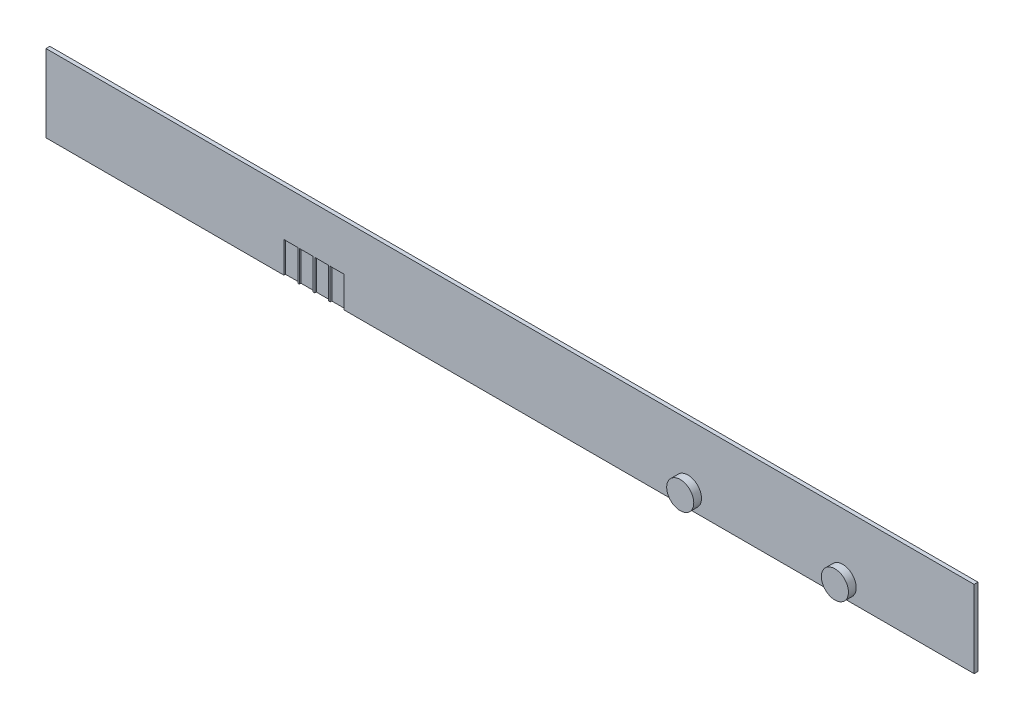
ISO-10303-21;
HEADER;
FILE_DESCRIPTION(('STEP AP214'),'2;1');
FILE_NAME('part.step','',(''),(''),'','','');
FILE_SCHEMA(('AUTOMOTIVE_DESIGN { 1 0 10303 214 1 1 1 1 }'));
ENDSEC;
DATA;
#1=APPLICATION_CONTEXT('core data for automotive mechanical design processes');
#2=APPLICATION_PROTOCOL_DEFINITION('international standard','automotive_design',2000,#1);
#3=PRODUCT_CONTEXT('',#1,'mechanical');
#4=PRODUCT('Part','Part','',(#3));
#5=PRODUCT_RELATED_PRODUCT_CATEGORY('part','',(#4));
#6=PRODUCT_DEFINITION_FORMATION('','',#4);
#7=PRODUCT_DEFINITION_CONTEXT('part definition',#1,'design');
#8=PRODUCT_DEFINITION('design','',#6,#7);
#9=PRODUCT_DEFINITION_SHAPE('','',#8);
#10=(LENGTH_UNIT() NAMED_UNIT(*) SI_UNIT(.MILLI.,.METRE.));
#11=(NAMED_UNIT(*) PLANE_ANGLE_UNIT() SI_UNIT($,.RADIAN.));
#12=(NAMED_UNIT(*) SI_UNIT($,.STERADIAN.) SOLID_ANGLE_UNIT());
#13=UNCERTAINTY_MEASURE_WITH_UNIT(LENGTH_MEASURE(1.E-05),#10,'distance_accuracy_value','');
#14=(GEOMETRIC_REPRESENTATION_CONTEXT(3) GLOBAL_UNCERTAINTY_ASSIGNED_CONTEXT((#13)) GLOBAL_UNIT_ASSIGNED_CONTEXT((#10,
#11,#12)) REPRESENTATION_CONTEXT('',''));
#15=CARTESIAN_POINT('',(0.,0.,0.));
#16=DIRECTION('',(0.,0.,1.));
#17=DIRECTION('',(1.,0.,0.));
#18=AXIS2_PLACEMENT_3D('',#15,#16,#17);
#19=CARTESIAN_POINT('',(60.,-5.,0.5));
#20=DIRECTION('',(-1.,0.,0.));
#21=DIRECTION('',(0.,0.,1.));
#22=AXIS2_PLACEMENT_3D('',#19,#20,#21);
#23=PLANE('',#22);
#24=DIRECTION('',(0.,1.,0.));
#25=VECTOR('',#24,1.);
#26=CARTESIAN_POINT('',(60.,-5.,0.));
#27=LINE('',#26,#25);
#28=CARTESIAN_POINT('',(60.,-5.,0.));
#29=VERTEX_POINT('',#28);
#30=CARTESIAN_POINT('',(60.,5.,0.));
#31=VERTEX_POINT('',#30);
#32=EDGE_CURVE('E299',#29,#31,#27,.T.);
#33=ORIENTED_EDGE('',*,*,#32,.T.);
#34=DIRECTION('',(0.,0.,-1.));
#35=VECTOR('',#34,1.);
#36=CARTESIAN_POINT('',(60.,5.,0.5));
#37=LINE('',#36,#35);
#38=CARTESIAN_POINT('',(60.,5.,0.5));
#39=VERTEX_POINT('',#38);
#40=EDGE_CURVE('E329',#39,#31,#37,.T.);
#41=ORIENTED_EDGE('',*,*,#40,.F.);
#42=DIRECTION('',(0.,1.,0.));
#43=VECTOR('',#42,1.);
#44=CARTESIAN_POINT('',(60.,-5.,0.5));
#45=LINE('',#44,#43);
#46=CARTESIAN_POINT('',(60.,-5.,0.5));
#47=VERTEX_POINT('',#46);
#48=EDGE_CURVE('E300',#47,#39,#45,.T.);
#49=ORIENTED_EDGE('',*,*,#48,.F.);
#50=DIRECTION('',(0.,0.,-1.));
#51=VECTOR('',#50,1.);
#52=CARTESIAN_POINT('',(60.,-5.,0.5));
#53=LINE('',#52,#51);
#54=EDGE_CURVE('E312',#47,#29,#53,.T.);
#55=ORIENTED_EDGE('',*,*,#54,.T.);
#56=EDGE_LOOP('',(#33,#41,#49,#55));
#57=FACE_BOUND('',#56,.T.);
#58=ADVANCED_FACE('F41',(#57),#23,.F.);
#59=CARTESIAN_POINT('',(-60.,5.,0.5));
#60=DIRECTION('',(0.,-1.,0.));
#61=DIRECTION('',(0.,0.,-1.));
#62=AXIS2_PLACEMENT_3D('',#59,#60,#61);
#63=PLANE('',#62);
#64=DIRECTION('',(-1.,0.,0.));
#65=VECTOR('',#64,1.);
#66=CARTESIAN_POINT('',(-60.,5.,0.));
#67=LINE('',#66,#65);
#68=CARTESIAN_POINT('',(-60.,5.,0.));
#69=VERTEX_POINT('',#68);
#70=EDGE_CURVE('E316',#31,#69,#67,.T.);
#71=ORIENTED_EDGE('',*,*,#70,.T.);
#72=DIRECTION('',(0.,0.,-1.));
#73=VECTOR('',#72,1.);
#74=CARTESIAN_POINT('',(-60.,5.,0.5));
#75=LINE('',#74,#73);
#76=CARTESIAN_POINT('',(-60.,5.,0.5));
#77=VERTEX_POINT('',#76);
#78=EDGE_CURVE('E326',#77,#69,#75,.T.);
#79=ORIENTED_EDGE('',*,*,#78,.F.);
#80=DIRECTION('',(-1.,0.,0.));
#81=VECTOR('',#80,1.);
#82=CARTESIAN_POINT('',(-60.,5.,0.5));
#83=LINE('',#82,#81);
#84=EDGE_CURVE('E303',#39,#77,#83,.T.);
#85=ORIENTED_EDGE('',*,*,#84,.F.);
#86=ORIENTED_EDGE('',*,*,#40,.T.);
#87=EDGE_LOOP('',(#71,#79,#85,#86));
#88=FACE_BOUND('',#87,.T.);
#89=ADVANCED_FACE('F365',(#88),#63,.F.);
#90=CARTESIAN_POINT('',(-60.,-5.,0.5));
#91=DIRECTION('',(1.,0.,0.));
#92=DIRECTION('',(0.,0.,-1.));
#93=AXIS2_PLACEMENT_3D('',#90,#91,#92);
#94=PLANE('',#93);
#95=DIRECTION('',(0.,-1.,0.));
#96=VECTOR('',#95,1.);
#97=CARTESIAN_POINT('',(-60.,-5.,0.));
#98=LINE('',#97,#96);
#99=CARTESIAN_POINT('',(-60.,-5.,0.));
#100=VERTEX_POINT('',#99);
#101=EDGE_CURVE('E318',#69,#100,#98,.T.);
#102=ORIENTED_EDGE('',*,*,#101,.T.);
#103=DIRECTION('',(0.,0.,-1.));
#104=VECTOR('',#103,1.);
#105=CARTESIAN_POINT('',(-60.,-5.,0.5));
#106=LINE('',#105,#104);
#107=CARTESIAN_POINT('',(-60.,-5.,0.5));
#108=VERTEX_POINT('',#107);
#109=EDGE_CURVE('E323',#108,#100,#106,.T.);
#110=ORIENTED_EDGE('',*,*,#109,.F.);
#111=DIRECTION('',(0.,-1.,0.));
#112=VECTOR('',#111,1.);
#113=CARTESIAN_POINT('',(-60.,-5.,0.5));
#114=LINE('',#113,#112);
#115=EDGE_CURVE('E306',#77,#108,#114,.T.);
#116=ORIENTED_EDGE('',*,*,#115,.F.);
#117=ORIENTED_EDGE('',*,*,#78,.T.);
#118=EDGE_LOOP('',(#102,#110,#116,#117));
#119=FACE_BOUND('',#118,.T.);
#120=ADVANCED_FACE('F370',(#119),#94,.F.);
#121=CARTESIAN_POINT('',(-60.,-5.,0.5));
#122=DIRECTION('',(0.,1.,0.));
#123=DIRECTION('',(0.,0.,1.));
#124=AXIS2_PLACEMENT_3D('',#121,#122,#123);
#125=PLANE('',#124);
#126=DIRECTION('',(1.,0.,0.));
#127=VECTOR('',#126,1.);
#128=CARTESIAN_POINT('',(-60.,-5.,0.5));
#129=LINE('',#128,#127);
#130=CARTESIAN_POINT('',(-25.45,-5.,0.5));
#131=VERTEX_POINT('',#130);
#132=CARTESIAN_POINT('',(-25.25,-5.,0.5));
#133=VERTEX_POINT('',#132);
#134=EDGE_CURVE('E646',#131,#133,#129,.T.);
#135=ORIENTED_EDGE('',*,*,#134,.F.);
#136=DIRECTION('',(0.,0.,1.));
#137=VECTOR('',#136,1.);
#138=CARTESIAN_POINT('',(-25.45,-5.,0.3));
#139=LINE('',#138,#137);
#140=CARTESIAN_POINT('',(-25.45,-5.,0.3));
#141=VERTEX_POINT('',#140);
#142=EDGE_CURVE('E210',#141,#131,#139,.T.);
#143=ORIENTED_EDGE('',*,*,#142,.F.);
#144=DIRECTION('',(1.,0.,0.));
#145=VECTOR('',#144,1.);
#146=CARTESIAN_POINT('',(-27.25,-5.,0.3));
#147=LINE('',#146,#145);
#148=CARTESIAN_POINT('',(-27.25,-5.,0.3));
#149=VERTEX_POINT('',#148);
#150=EDGE_CURVE('E192',#149,#141,#147,.T.);
#151=ORIENTED_EDGE('',*,*,#150,.F.);
#152=DIRECTION('',(0.,0.,1.));
#153=VECTOR('',#152,1.);
#154=CARTESIAN_POINT('',(-27.25,-5.,0.3));
#155=LINE('',#154,#153);
#156=CARTESIAN_POINT('',(-27.25,-5.,0.5));
#157=VERTEX_POINT('',#156);
#158=EDGE_CURVE('E183',#149,#157,#155,.T.);
#159=ORIENTED_EDGE('',*,*,#158,.T.);
#160=CARTESIAN_POINT('',(-27.45,-5.,0.5));
#161=VERTEX_POINT('',#160);
#162=EDGE_CURVE('E313',#161,#157,#129,.T.);
#163=ORIENTED_EDGE('',*,*,#162,.F.);
#164=DIRECTION('',(0.,0.,1.));
#165=VECTOR('',#164,1.);
#166=CARTESIAN_POINT('',(-27.45,-5.,0.3));
#167=LINE('',#166,#165);
#168=CARTESIAN_POINT('',(-27.45,-5.,0.3));
#169=VERTEX_POINT('',#168);
#170=EDGE_CURVE('E287',#169,#161,#167,.T.);
#171=ORIENTED_EDGE('',*,*,#170,.F.);
#172=DIRECTION('',(1.,0.,0.));
#173=VECTOR('',#172,1.);
#174=CARTESIAN_POINT('',(-29.25,-5.,0.3));
#175=LINE('',#174,#173);
#176=CARTESIAN_POINT('',(-29.25,-5.,0.3));
#177=VERTEX_POINT('',#176);
#178=EDGE_CURVE('E273',#177,#169,#175,.T.);
#179=ORIENTED_EDGE('',*,*,#178,.F.);
#180=DIRECTION('',(0.,0.,1.));
#181=VECTOR('',#180,1.);
#182=CARTESIAN_POINT('',(-29.25,-5.,0.3));
#183=LINE('',#182,#181);
#184=CARTESIAN_POINT('',(-29.25,-5.,0.5));
#185=VERTEX_POINT('',#184);
#186=EDGE_CURVE('E289',#177,#185,#183,.T.);
#187=ORIENTED_EDGE('',*,*,#186,.T.);
#188=EDGE_CURVE('E309',#108,#185,#129,.T.);
#189=ORIENTED_EDGE('',*,*,#188,.F.);
#190=ORIENTED_EDGE('',*,*,#109,.T.);
#191=DIRECTION('',(1.,0.,0.));
#192=VECTOR('',#191,1.);
#193=CARTESIAN_POINT('',(-60.,-5.,0.));
#194=LINE('',#193,#192);
#195=EDGE_CURVE('E304',#100,#29,#194,.T.);
#196=ORIENTED_EDGE('',*,*,#195,.T.);
#197=ORIENTED_EDGE('',*,*,#54,.F.);
#198=CARTESIAN_POINT('',(-21.45,-5.,0.5));
#199=VERTEX_POINT('',#198);
#200=EDGE_CURVE('E308',#199,#47,#129,.T.);
#201=ORIENTED_EDGE('',*,*,#200,.F.);
#202=DIRECTION('',(0.,0.,1.));
#203=VECTOR('',#202,1.);
#204=CARTESIAN_POINT('',(-21.45,-5.,0.3));
#205=LINE('',#204,#203);
#206=CARTESIAN_POINT('',(-21.45,-5.,0.3));
#207=VERTEX_POINT('',#206);
#208=EDGE_CURVE('E259',#207,#199,#205,.T.);
#209=ORIENTED_EDGE('',*,*,#208,.F.);
#210=DIRECTION('',(1.,0.,0.));
#211=VECTOR('',#210,1.);
#212=CARTESIAN_POINT('',(-23.25,-5.,0.3));
#213=LINE('',#212,#211);
#214=CARTESIAN_POINT('',(-23.25,-5.,0.3));
#215=VERTEX_POINT('',#214);
#216=EDGE_CURVE('E246',#215,#207,#213,.T.);
#217=ORIENTED_EDGE('',*,*,#216,.F.);
#218=DIRECTION('',(0.,0.,1.));
#219=VECTOR('',#218,1.);
#220=CARTESIAN_POINT('',(-23.25,-5.,0.3));
#221=LINE('',#220,#219);
#222=CARTESIAN_POINT('',(-23.25,-5.,0.5));
#223=VERTEX_POINT('',#222);
#224=EDGE_CURVE('E261',#215,#223,#221,.T.);
#225=ORIENTED_EDGE('',*,*,#224,.T.);
#226=CARTESIAN_POINT('',(-23.45,-5.,0.5));
#227=VERTEX_POINT('',#226);
#228=EDGE_CURVE('E385',#227,#223,#129,.T.);
#229=ORIENTED_EDGE('',*,*,#228,.F.);
#230=DIRECTION('',(0.,0.,1.));
#231=VECTOR('',#230,1.);
#232=CARTESIAN_POINT('',(-23.45,-5.,0.3));
#233=LINE('',#232,#231);
#234=CARTESIAN_POINT('',(-23.45,-5.,0.3));
#235=VERTEX_POINT('',#234);
#236=EDGE_CURVE('E233',#235,#227,#233,.T.);
#237=ORIENTED_EDGE('',*,*,#236,.F.);
#238=DIRECTION('',(1.,0.,0.));
#239=VECTOR('',#238,1.);
#240=CARTESIAN_POINT('',(-25.25,-5.,0.3));
#241=LINE('',#240,#239);
#242=CARTESIAN_POINT('',(-25.25,-5.,0.3));
#243=VERTEX_POINT('',#242);
#244=EDGE_CURVE('E220',#243,#235,#241,.T.);
#245=ORIENTED_EDGE('',*,*,#244,.F.);
#246=DIRECTION('',(0.,0.,1.));
#247=VECTOR('',#246,1.);
#248=CARTESIAN_POINT('',(-25.25,-5.,0.3));
#249=LINE('',#248,#247);
#250=EDGE_CURVE('E235',#243,#133,#249,.T.);
#251=ORIENTED_EDGE('',*,*,#250,.T.);
#252=EDGE_LOOP('',(#135,#143,#151,#159,#163,#171,#179,#187,#189,#190,#196,#197,#201,#209,#217,
#225,#229,#237,#245,#251));
#253=FACE_BOUND('',#252,.T.);
#254=ADVANCED_FACE('F340',(#253),#125,.F.);
#255=CARTESIAN_POINT('',(0.,0.,0.5));
#256=DIRECTION('',(0.,0.,-1.));
#257=DIRECTION('',(-1.,0.,0.));
#258=AXIS2_PLACEMENT_3D('',#255,#256,#257);
#259=PLANE('',#258);
#260=CARTESIAN_POINT('',(43.,-3.,0.5));
#261=DIRECTION('',(0.,0.,-1.));
#262=DIRECTION('',(-1.,0.,0.));
#263=AXIS2_PLACEMENT_3D('',#260,#261,#262);
#264=CIRCLE('',#263,1.75);
#265=CARTESIAN_POINT('',(41.25,-3.,0.5));
#266=VERTEX_POINT('',#265);
#267=EDGE_CURVE('E11',#266,#266,#264,.F.);
#268=ORIENTED_EDGE('',*,*,#267,.F.);
#269=EDGE_LOOP('',(#268));
#270=FACE_BOUND('',#269,.T.);
#271=CARTESIAN_POINT('',(23.,-3.,0.5));
#272=DIRECTION('',(0.,0.,-1.));
#273=DIRECTION('',(-1.,0.,0.));
#274=AXIS2_PLACEMENT_3D('',#271,#272,#273);
#275=CIRCLE('',#274,1.75);
#276=CARTESIAN_POINT('',(21.25,-3.,0.5));
#277=VERTEX_POINT('',#276);
#278=EDGE_CURVE('E48',#277,#277,#275,.F.);
#279=ORIENTED_EDGE('',*,*,#278,.F.);
#280=EDGE_LOOP('',(#279));
#281=FACE_BOUND('',#280,.T.);
#282=DIRECTION('',(-1.,0.,0.));
#283=VECTOR('',#282,1.);
#284=CARTESIAN_POINT('',(-27.25,-1.,0.5));
#285=LINE('',#284,#283);
#286=CARTESIAN_POINT('',(-25.45,-1.,0.5));
#287=VERTEX_POINT('',#286);
#288=CARTESIAN_POINT('',(-27.25,-1.,0.5));
#289=VERTEX_POINT('',#288);
#290=EDGE_CURVE('E55',#287,#289,#285,.T.);
#291=ORIENTED_EDGE('',*,*,#290,.F.);
#292=DIRECTION('',(0.,1.,0.));
#293=VECTOR('',#292,1.);
#294=CARTESIAN_POINT('',(-25.45,-5.,0.5));
#295=LINE('',#294,#293);
#296=EDGE_CURVE('E196',#131,#287,#295,.T.);
#297=ORIENTED_EDGE('',*,*,#296,.F.);
#298=ORIENTED_EDGE('',*,*,#134,.T.);
#299=DIRECTION('',(0.,-1.,0.));
#300=VECTOR('',#299,1.);
#301=CARTESIAN_POINT('',(-25.25,-5.,0.5));
#302=LINE('',#301,#300);
#303=CARTESIAN_POINT('',(-25.25,-1.,0.5));
#304=VERTEX_POINT('',#303);
#305=EDGE_CURVE('E227',#304,#133,#302,.T.);
#306=ORIENTED_EDGE('',*,*,#305,.F.);
#307=DIRECTION('',(-1.,0.,0.));
#308=VECTOR('',#307,1.);
#309=CARTESIAN_POINT('',(-25.25,-1.,0.5));
#310=LINE('',#309,#308);
#311=CARTESIAN_POINT('',(-23.45,-1.,0.5));
#312=VERTEX_POINT('',#311);
#313=EDGE_CURVE('E63',#312,#304,#310,.T.);
#314=ORIENTED_EDGE('',*,*,#313,.F.);
#315=DIRECTION('',(0.,1.,0.));
#316=VECTOR('',#315,1.);
#317=CARTESIAN_POINT('',(-23.45,-5.,0.5));
#318=LINE('',#317,#316);
#319=EDGE_CURVE('E217',#227,#312,#318,.T.);
#320=ORIENTED_EDGE('',*,*,#319,.F.);
#321=ORIENTED_EDGE('',*,*,#228,.T.);
#322=DIRECTION('',(0.,-1.,0.));
#323=VECTOR('',#322,1.);
#324=CARTESIAN_POINT('',(-23.25,-5.,0.5));
#325=LINE('',#324,#323);
#326=CARTESIAN_POINT('',(-23.25,-1.,0.5));
#327=VERTEX_POINT('',#326);
#328=EDGE_CURVE('E254',#327,#223,#325,.T.);
#329=ORIENTED_EDGE('',*,*,#328,.F.);
#330=DIRECTION('',(-1.,0.,0.));
#331=VECTOR('',#330,1.);
#332=CARTESIAN_POINT('',(-23.25,-1.,0.5));
#333=LINE('',#332,#331);
#334=CARTESIAN_POINT('',(-21.45,-1.,0.5));
#335=VERTEX_POINT('',#334);
#336=EDGE_CURVE('E252',#335,#327,#333,.T.);
#337=ORIENTED_EDGE('',*,*,#336,.F.);
#338=DIRECTION('',(0.,1.,0.));
#339=VECTOR('',#338,1.);
#340=CARTESIAN_POINT('',(-21.45,-5.,0.5));
#341=LINE('',#340,#339);
#342=EDGE_CURVE('E243',#199,#335,#341,.T.);
#343=ORIENTED_EDGE('',*,*,#342,.F.);
#344=ORIENTED_EDGE('',*,*,#200,.T.);
#345=ORIENTED_EDGE('',*,*,#48,.T.);
#346=ORIENTED_EDGE('',*,*,#84,.T.);
#347=ORIENTED_EDGE('',*,*,#115,.T.);
#348=ORIENTED_EDGE('',*,*,#188,.T.);
#349=DIRECTION('',(0.,-1.,0.));
#350=VECTOR('',#349,1.);
#351=CARTESIAN_POINT('',(-29.25,-5.,0.5));
#352=LINE('',#351,#350);
#353=CARTESIAN_POINT('',(-29.25,-1.,0.5));
#354=VERTEX_POINT('',#353);
#355=EDGE_CURVE('E280',#354,#185,#352,.T.);
#356=ORIENTED_EDGE('',*,*,#355,.F.);
#357=DIRECTION('',(-1.,0.,0.));
#358=VECTOR('',#357,1.);
#359=CARTESIAN_POINT('',(-29.25,-1.,0.5));
#360=LINE('',#359,#358);
#361=CARTESIAN_POINT('',(-27.45,-1.,0.5));
#362=VERTEX_POINT('',#361);
#363=EDGE_CURVE('E209',#362,#354,#360,.T.);
#364=ORIENTED_EDGE('',*,*,#363,.F.);
#365=DIRECTION('',(0.,1.,0.));
#366=VECTOR('',#365,1.);
#367=CARTESIAN_POINT('',(-27.45,-5.,0.5));
#368=LINE('',#367,#366);
#369=EDGE_CURVE('E270',#161,#362,#368,.T.);
#370=ORIENTED_EDGE('',*,*,#369,.F.);
#371=ORIENTED_EDGE('',*,*,#162,.T.);
#372=DIRECTION('',(0.,-1.,0.));
#373=VECTOR('',#372,1.);
#374=CARTESIAN_POINT('',(-27.25,-5.,0.5));
#375=LINE('',#374,#373);
#376=EDGE_CURVE('E199',#289,#157,#375,.T.);
#377=ORIENTED_EDGE('',*,*,#376,.F.);
#378=EDGE_LOOP('',(#291,#297,#298,#306,#314,#320,#321,#329,#337,#343,#344,#345,#346,#347,#348,
#356,#364,#370,#371,#377));
#379=FACE_BOUND('',#378,.T.);
#380=ADVANCED_FACE('F336',(#270,#281,#379),#259,.F.);
#381=CARTESIAN_POINT('',(0.,0.,0.));
#382=DIRECTION('',(0.,0.,-1.));
#383=DIRECTION('',(-1.,0.,0.));
#384=AXIS2_PLACEMENT_3D('',#381,#382,#383);
#385=PLANE('',#384);
#386=ORIENTED_EDGE('',*,*,#32,.F.);
#387=ORIENTED_EDGE('',*,*,#195,.F.);
#388=ORIENTED_EDGE('',*,*,#101,.F.);
#389=ORIENTED_EDGE('',*,*,#70,.F.);
#390=EDGE_LOOP('',(#386,#387,#388,#389));
#391=FACE_BOUND('',#390,.T.);
#392=ADVANCED_FACE('F339',(#391),#385,.T.);
#393=CARTESIAN_POINT('',(23.,-3.,1.5));
#394=DIRECTION('',(0.,0.,-1.));
#395=DIRECTION('',(-1.,0.,0.));
#396=AXIS2_PLACEMENT_3D('',#393,#394,#395);
#397=CYLINDRICAL_SURFACE('',#396,1.75);
#398=CARTESIAN_POINT('',(23.,-3.,1.5));
#399=DIRECTION('',(0.,0.,1.));
#400=DIRECTION('',(1.,0.,0.));
#401=AXIS2_PLACEMENT_3D('',#398,#399,#400);
#402=CIRCLE('',#401,1.75);
#403=CARTESIAN_POINT('',(24.75,-3.,1.5));
#404=VERTEX_POINT('',#403);
#405=EDGE_CURVE('E296',#404,#404,#402,.T.);
#406=ORIENTED_EDGE('',*,*,#405,.F.);
#407=EDGE_LOOP('',(#406));
#408=FACE_BOUND('',#407,.T.);
#409=ORIENTED_EDGE('',*,*,#278,.T.);
#410=EDGE_LOOP('',(#409));
#411=FACE_BOUND('',#410,.T.);
#412=ADVANCED_FACE('F334',(#408,#411),#397,.T.);
#413=CARTESIAN_POINT('',(23.,-3.,1.5));
#414=DIRECTION('',(0.,0.,1.));
#415=DIRECTION('',(1.,0.,0.));
#416=AXIS2_PLACEMENT_3D('',#413,#414,#415);
#417=PLANE('',#416);
#418=ORIENTED_EDGE('',*,*,#405,.T.);
#419=EDGE_LOOP('',(#418));
#420=FACE_BOUND('',#419,.T.);
#421=ADVANCED_FACE('F418',(#420),#417,.T.);
#422=CARTESIAN_POINT('',(43.,-3.,1.5));
#423=DIRECTION('',(0.,0.,-1.));
#424=DIRECTION('',(-1.,0.,0.));
#425=AXIS2_PLACEMENT_3D('',#422,#423,#424);
#426=CYLINDRICAL_SURFACE('',#425,1.75);
#427=CARTESIAN_POINT('',(43.,-3.,1.5));
#428=DIRECTION('',(0.,0.,1.));
#429=DIRECTION('',(1.,0.,0.));
#430=AXIS2_PLACEMENT_3D('',#427,#428,#429);
#431=CIRCLE('',#430,1.75);
#432=CARTESIAN_POINT('',(44.75,-3.,1.5));
#433=VERTEX_POINT('',#432);
#434=EDGE_CURVE('E286',#433,#433,#431,.T.);
#435=ORIENTED_EDGE('',*,*,#434,.F.);
#436=EDGE_LOOP('',(#435));
#437=FACE_BOUND('',#436,.T.);
#438=ORIENTED_EDGE('',*,*,#267,.T.);
#439=EDGE_LOOP('',(#438));
#440=FACE_BOUND('',#439,.T.);
#441=ADVANCED_FACE('F411',(#437,#440),#426,.T.);
#442=CARTESIAN_POINT('',(43.,-3.,1.5));
#443=DIRECTION('',(0.,0.,1.));
#444=DIRECTION('',(1.,0.,0.));
#445=AXIS2_PLACEMENT_3D('',#442,#443,#444);
#446=PLANE('',#445);
#447=ORIENTED_EDGE('',*,*,#434,.T.);
#448=EDGE_LOOP('',(#447));
#449=FACE_BOUND('',#448,.T.);
#450=ADVANCED_FACE('F404',(#449),#446,.T.);
#451=CARTESIAN_POINT('',(-29.25,-1.,0.3));
#452=DIRECTION('',(0.,1.,0.));
#453=DIRECTION('',(0.,0.,1.));
#454=AXIS2_PLACEMENT_3D('',#451,#452,#453);
#455=PLANE('',#454);
#456=ORIENTED_EDGE('',*,*,#363,.T.);
#457=DIRECTION('',(0.,0.,1.));
#458=VECTOR('',#457,1.);
#459=CARTESIAN_POINT('',(-29.25,-1.,0.3));
#460=LINE('',#459,#458);
#461=CARTESIAN_POINT('',(-29.25,-1.,0.3));
#462=VERTEX_POINT('',#461);
#463=EDGE_CURVE('E278',#462,#354,#460,.T.);
#464=ORIENTED_EDGE('',*,*,#463,.F.);
#465=DIRECTION('',(-1.,0.,0.));
#466=VECTOR('',#465,1.);
#467=CARTESIAN_POINT('',(-29.25,-1.,0.3));
#468=LINE('',#467,#466);
#469=CARTESIAN_POINT('',(-27.45,-1.,0.3));
#470=VERTEX_POINT('',#469);
#471=EDGE_CURVE('E266',#470,#462,#468,.T.);
#472=ORIENTED_EDGE('',*,*,#471,.F.);
#473=DIRECTION('',(0.,0.,1.));
#474=VECTOR('',#473,1.);
#475=CARTESIAN_POINT('',(-27.45,-1.,0.3));
#476=LINE('',#475,#474);
#477=EDGE_CURVE('E284',#470,#362,#476,.T.);
#478=ORIENTED_EDGE('',*,*,#477,.T.);
#479=EDGE_LOOP('',(#456,#464,#472,#478));
#480=FACE_BOUND('',#479,.T.);
#481=ADVANCED_FACE('F402',(#480),#455,.F.);
#482=CARTESIAN_POINT('',(-27.45,-5.,0.3));
#483=DIRECTION('',(1.,0.,0.));
#484=DIRECTION('',(0.,0.,-1.));
#485=AXIS2_PLACEMENT_3D('',#482,#483,#484);
#486=PLANE('',#485);
#487=ORIENTED_EDGE('',*,*,#369,.T.);
#488=ORIENTED_EDGE('',*,*,#477,.F.);
#489=DIRECTION('',(0.,1.,0.));
#490=VECTOR('',#489,1.);
#491=CARTESIAN_POINT('',(-27.45,-5.,0.3));
#492=LINE('',#491,#490);
#493=EDGE_CURVE('E275',#169,#470,#492,.T.);
#494=ORIENTED_EDGE('',*,*,#493,.F.);
#495=ORIENTED_EDGE('',*,*,#170,.T.);
#496=EDGE_LOOP('',(#487,#488,#494,#495));
#497=FACE_BOUND('',#496,.T.);
#498=ADVANCED_FACE('F399',(#497),#486,.F.);
#499=CARTESIAN_POINT('',(-29.25,-5.,0.3));
#500=DIRECTION('',(-1.,0.,0.));
#501=DIRECTION('',(0.,0.,1.));
#502=AXIS2_PLACEMENT_3D('',#499,#500,#501);
#503=PLANE('',#502);
#504=ORIENTED_EDGE('',*,*,#355,.T.);
#505=ORIENTED_EDGE('',*,*,#186,.F.);
#506=DIRECTION('',(0.,-1.,0.));
#507=VECTOR('',#506,1.);
#508=CARTESIAN_POINT('',(-29.25,-5.,0.3));
#509=LINE('',#508,#507);
#510=EDGE_CURVE('E269',#462,#177,#509,.T.);
#511=ORIENTED_EDGE('',*,*,#510,.F.);
#512=ORIENTED_EDGE('',*,*,#463,.T.);
#513=EDGE_LOOP('',(#504,#505,#511,#512));
#514=FACE_BOUND('',#513,.T.);
#515=ADVANCED_FACE('F392',(#514),#503,.F.);
#516=CARTESIAN_POINT('',(0.,0.,0.3));
#517=DIRECTION('',(0.,0.,1.));
#518=DIRECTION('',(1.,0.,0.));
#519=AXIS2_PLACEMENT_3D('',#516,#517,#518);
#520=PLANE('',#519);
#521=ORIENTED_EDGE('',*,*,#471,.T.);
#522=ORIENTED_EDGE('',*,*,#510,.T.);
#523=ORIENTED_EDGE('',*,*,#178,.T.);
#524=ORIENTED_EDGE('',*,*,#493,.T.);
#525=EDGE_LOOP('',(#521,#522,#523,#524));
#526=FACE_BOUND('',#525,.T.);
#527=ADVANCED_FACE('F397',(#526),#520,.T.);
#528=CARTESIAN_POINT('',(-23.25,-1.,0.3));
#529=DIRECTION('',(0.,1.,0.));
#530=DIRECTION('',(0.,0.,1.));
#531=AXIS2_PLACEMENT_3D('',#528,#529,#530);
#532=PLANE('',#531);
#533=ORIENTED_EDGE('',*,*,#336,.T.);
#534=DIRECTION('',(0.,0.,1.));
#535=VECTOR('',#534,1.);
#536=CARTESIAN_POINT('',(-23.25,-1.,0.3));
#537=LINE('',#536,#535);
#538=CARTESIAN_POINT('',(-23.25,-1.,0.3));
#539=VERTEX_POINT('',#538);
#540=EDGE_CURVE('E251',#539,#327,#537,.T.);
#541=ORIENTED_EDGE('',*,*,#540,.F.);
#542=DIRECTION('',(-1.,0.,0.));
#543=VECTOR('',#542,1.);
#544=CARTESIAN_POINT('',(-23.25,-1.,0.3));
#545=LINE('',#544,#543);
#546=CARTESIAN_POINT('',(-21.45,-1.,0.3));
#547=VERTEX_POINT('',#546);
#548=EDGE_CURVE('E239',#547,#539,#545,.T.);
#549=ORIENTED_EDGE('',*,*,#548,.F.);
#550=DIRECTION('',(0.,0.,1.));
#551=VECTOR('',#550,1.);
#552=CARTESIAN_POINT('',(-21.45,-1.,0.3));
#553=LINE('',#552,#551);
#554=EDGE_CURVE('E228',#547,#335,#553,.T.);
#555=ORIENTED_EDGE('',*,*,#554,.T.);
#556=EDGE_LOOP('',(#533,#541,#549,#555));
#557=FACE_BOUND('',#556,.T.);
#558=ADVANCED_FACE('F477',(#557),#532,.F.);
#559=CARTESIAN_POINT('',(-21.45,-5.,0.3));
#560=DIRECTION('',(1.,0.,0.));
#561=DIRECTION('',(0.,0.,-1.));
#562=AXIS2_PLACEMENT_3D('',#559,#560,#561);
#563=PLANE('',#562);
#564=ORIENTED_EDGE('',*,*,#342,.T.);
#565=ORIENTED_EDGE('',*,*,#554,.F.);
#566=DIRECTION('',(0.,1.,0.));
#567=VECTOR('',#566,1.);
#568=CARTESIAN_POINT('',(-21.45,-5.,0.3));
#569=LINE('',#568,#567);
#570=EDGE_CURVE('E248',#207,#547,#569,.T.);
#571=ORIENTED_EDGE('',*,*,#570,.F.);
#572=ORIENTED_EDGE('',*,*,#208,.T.);
#573=EDGE_LOOP('',(#564,#565,#571,#572));
#574=FACE_BOUND('',#573,.T.);
#575=ADVANCED_FACE('F485',(#574),#563,.F.);
#576=CARTESIAN_POINT('',(-23.25,-5.,0.3));
#577=DIRECTION('',(-1.,0.,0.));
#578=DIRECTION('',(0.,0.,1.));
#579=AXIS2_PLACEMENT_3D('',#576,#577,#578);
#580=PLANE('',#579);
#581=ORIENTED_EDGE('',*,*,#328,.T.);
#582=ORIENTED_EDGE('',*,*,#224,.F.);
#583=DIRECTION('',(0.,-1.,0.));
#584=VECTOR('',#583,1.);
#585=CARTESIAN_POINT('',(-23.25,-5.,0.3));
#586=LINE('',#585,#584);
#587=EDGE_CURVE('E242',#539,#215,#586,.T.);
#588=ORIENTED_EDGE('',*,*,#587,.F.);
#589=ORIENTED_EDGE('',*,*,#540,.T.);
#590=EDGE_LOOP('',(#581,#582,#588,#589));
#591=FACE_BOUND('',#590,.T.);
#592=ADVANCED_FACE('F494',(#591),#580,.F.);
#593=CARTESIAN_POINT('',(6.,0.,0.3));
#594=DIRECTION('',(0.,0.,1.));
#595=DIRECTION('',(1.,0.,0.));
#596=AXIS2_PLACEMENT_3D('',#593,#594,#595);
#597=PLANE('',#596);
#598=ORIENTED_EDGE('',*,*,#548,.T.);
#599=ORIENTED_EDGE('',*,*,#587,.T.);
#600=ORIENTED_EDGE('',*,*,#216,.T.);
#601=ORIENTED_EDGE('',*,*,#570,.T.);
#602=EDGE_LOOP('',(#598,#599,#600,#601));
#603=FACE_BOUND('',#602,.T.);
#604=ADVANCED_FACE('F503',(#603),#597,.T.);
#605=CARTESIAN_POINT('',(-25.25,-1.,0.3));
#606=DIRECTION('',(0.,1.,0.));
#607=DIRECTION('',(0.,0.,1.));
#608=AXIS2_PLACEMENT_3D('',#605,#606,#607);
#609=PLANE('',#608);
#610=ORIENTED_EDGE('',*,*,#313,.T.);
#611=DIRECTION('',(0.,0.,1.));
#612=VECTOR('',#611,1.);
#613=CARTESIAN_POINT('',(-25.25,-1.,0.3));
#614=LINE('',#613,#612);
#615=CARTESIAN_POINT('',(-25.25,-1.,0.3));
#616=VERTEX_POINT('',#615);
#617=EDGE_CURVE('E225',#616,#304,#614,.T.);
#618=ORIENTED_EDGE('',*,*,#617,.F.);
#619=DIRECTION('',(-1.,0.,0.));
#620=VECTOR('',#619,1.);
#621=CARTESIAN_POINT('',(-25.25,-1.,0.3));
#622=LINE('',#621,#620);
#623=CARTESIAN_POINT('',(-23.45,-1.,0.3));
#624=VERTEX_POINT('',#623);
#625=EDGE_CURVE('E213',#624,#616,#622,.T.);
#626=ORIENTED_EDGE('',*,*,#625,.F.);
#627=DIRECTION('',(0.,0.,1.));
#628=VECTOR('',#627,1.);
#629=CARTESIAN_POINT('',(-23.45,-1.,0.3));
#630=LINE('',#629,#628);
#631=EDGE_CURVE('E205',#624,#312,#630,.T.);
#632=ORIENTED_EDGE('',*,*,#631,.T.);
#633=EDGE_LOOP('',(#610,#618,#626,#632));
#634=FACE_BOUND('',#633,.T.);
#635=ADVANCED_FACE('F512',(#634),#609,.F.);
#636=CARTESIAN_POINT('',(-23.45,-5.,0.3));
#637=DIRECTION('',(1.,0.,0.));
#638=DIRECTION('',(0.,0.,-1.));
#639=AXIS2_PLACEMENT_3D('',#636,#637,#638);
#640=PLANE('',#639);
#641=ORIENTED_EDGE('',*,*,#319,.T.);
#642=ORIENTED_EDGE('',*,*,#631,.F.);
#643=DIRECTION('',(0.,1.,0.));
#644=VECTOR('',#643,1.);
#645=CARTESIAN_POINT('',(-23.45,-5.,0.3));
#646=LINE('',#645,#644);
#647=EDGE_CURVE('E222',#235,#624,#646,.T.);
#648=ORIENTED_EDGE('',*,*,#647,.F.);
#649=ORIENTED_EDGE('',*,*,#236,.T.);
#650=EDGE_LOOP('',(#641,#642,#648,#649));
#651=FACE_BOUND('',#650,.T.);
#652=ADVANCED_FACE('F521',(#651),#640,.F.);
#653=CARTESIAN_POINT('',(-25.25,-5.,0.3));
#654=DIRECTION('',(-1.,0.,0.));
#655=DIRECTION('',(0.,0.,1.));
#656=AXIS2_PLACEMENT_3D('',#653,#654,#655);
#657=PLANE('',#656);
#658=ORIENTED_EDGE('',*,*,#305,.T.);
#659=ORIENTED_EDGE('',*,*,#250,.F.);
#660=DIRECTION('',(0.,-1.,0.));
#661=VECTOR('',#660,1.);
#662=CARTESIAN_POINT('',(-25.25,-5.,0.3));
#663=LINE('',#662,#661);
#664=EDGE_CURVE('E216',#616,#243,#663,.T.);
#665=ORIENTED_EDGE('',*,*,#664,.F.);
#666=ORIENTED_EDGE('',*,*,#617,.T.);
#667=EDGE_LOOP('',(#658,#659,#665,#666));
#668=FACE_BOUND('',#667,.T.);
#669=ADVANCED_FACE('F529',(#668),#657,.F.);
#670=CARTESIAN_POINT('',(4.,0.,0.3));
#671=DIRECTION('',(0.,0.,1.));
#672=DIRECTION('',(1.,0.,0.));
#673=AXIS2_PLACEMENT_3D('',#670,#671,#672);
#674=PLANE('',#673);
#675=ORIENTED_EDGE('',*,*,#625,.T.);
#676=ORIENTED_EDGE('',*,*,#664,.T.);
#677=ORIENTED_EDGE('',*,*,#244,.T.);
#678=ORIENTED_EDGE('',*,*,#647,.T.);
#679=EDGE_LOOP('',(#675,#676,#677,#678));
#680=FACE_BOUND('',#679,.T.);
#681=ADVANCED_FACE('F361',(#680),#674,.T.);
#682=CARTESIAN_POINT('',(-27.25,-1.,0.3));
#683=DIRECTION('',(0.,1.,0.));
#684=DIRECTION('',(0.,0.,1.));
#685=AXIS2_PLACEMENT_3D('',#682,#683,#684);
#686=PLANE('',#685);
#687=ORIENTED_EDGE('',*,*,#290,.T.);
#688=DIRECTION('',(0.,0.,1.));
#689=VECTOR('',#688,1.);
#690=CARTESIAN_POINT('',(-27.25,-1.,0.3));
#691=LINE('',#690,#689);
#692=CARTESIAN_POINT('',(-27.25,-1.,0.3));
#693=VERTEX_POINT('',#692);
#694=EDGE_CURVE('E175',#693,#289,#691,.T.);
#695=ORIENTED_EDGE('',*,*,#694,.F.);
#696=DIRECTION('',(-1.,0.,0.));
#697=VECTOR('',#696,1.);
#698=CARTESIAN_POINT('',(-27.25,-1.,0.3));
#699=LINE('',#698,#697);
#700=CARTESIAN_POINT('',(-25.45,-1.,0.3));
#701=VERTEX_POINT('',#700);
#702=EDGE_CURVE('E179',#701,#693,#699,.T.);
#703=ORIENTED_EDGE('',*,*,#702,.F.);
#704=DIRECTION('',(0.,0.,1.));
#705=VECTOR('',#704,1.);
#706=CARTESIAN_POINT('',(-25.45,-1.,0.3));
#707=LINE('',#706,#705);
#708=EDGE_CURVE('E207',#701,#287,#707,.T.);
#709=ORIENTED_EDGE('',*,*,#708,.T.);
#710=EDGE_LOOP('',(#687,#695,#703,#709));
#711=FACE_BOUND('',#710,.T.);
#712=ADVANCED_FACE('F177',(#711),#686,.F.);
#713=CARTESIAN_POINT('',(-25.45,-5.,0.3));
#714=DIRECTION('',(1.,0.,0.));
#715=DIRECTION('',(0.,0.,-1.));
#716=AXIS2_PLACEMENT_3D('',#713,#714,#715);
#717=PLANE('',#716);
#718=ORIENTED_EDGE('',*,*,#296,.T.);
#719=ORIENTED_EDGE('',*,*,#708,.F.);
#720=DIRECTION('',(0.,1.,0.));
#721=VECTOR('',#720,1.);
#722=CARTESIAN_POINT('',(-25.45,-5.,0.3));
#723=LINE('',#722,#721);
#724=EDGE_CURVE('E184',#141,#701,#723,.T.);
#725=ORIENTED_EDGE('',*,*,#724,.F.);
#726=ORIENTED_EDGE('',*,*,#142,.T.);
#727=EDGE_LOOP('',(#718,#719,#725,#726));
#728=FACE_BOUND('',#727,.T.);
#729=ADVANCED_FACE('F353',(#728),#717,.F.);
#730=CARTESIAN_POINT('',(-27.25,-5.,0.3));
#731=DIRECTION('',(-1.,0.,0.));
#732=DIRECTION('',(0.,0.,1.));
#733=AXIS2_PLACEMENT_3D('',#730,#731,#732);
#734=PLANE('',#733);
#735=ORIENTED_EDGE('',*,*,#376,.T.);
#736=ORIENTED_EDGE('',*,*,#158,.F.);
#737=DIRECTION('',(0.,-1.,0.));
#738=VECTOR('',#737,1.);
#739=CARTESIAN_POINT('',(-27.25,-5.,0.3));
#740=LINE('',#739,#738);
#741=EDGE_CURVE('E187',#693,#149,#740,.T.);
#742=ORIENTED_EDGE('',*,*,#741,.F.);
#743=ORIENTED_EDGE('',*,*,#694,.T.);
#744=EDGE_LOOP('',(#735,#736,#742,#743));
#745=FACE_BOUND('',#744,.T.);
#746=ADVANCED_FACE('F188',(#745),#734,.F.);
#747=CARTESIAN_POINT('',(2.,0.,0.3));
#748=DIRECTION('',(0.,0.,1.));
#749=DIRECTION('',(1.,0.,0.));
#750=AXIS2_PLACEMENT_3D('',#747,#748,#749);
#751=PLANE('',#750);
#752=ORIENTED_EDGE('',*,*,#702,.T.);
#753=ORIENTED_EDGE('',*,*,#741,.T.);
#754=ORIENTED_EDGE('',*,*,#150,.T.);
#755=ORIENTED_EDGE('',*,*,#724,.T.);
#756=EDGE_LOOP('',(#752,#753,#754,#755));
#757=FACE_BOUND('',#756,.T.);
#758=ADVANCED_FACE('F194',(#757),#751,.T.);
#759=CLOSED_SHELL('',(#58,#89,#120,#254,#380,#392,#412,#421,#441,#450,#481,#498,#515,#527,#558,
#575,#592,#604,#635,#652,#669,#681,#712,#729,#746,#758));
#760=MANIFOLD_SOLID_BREP('B2',#759);
#761=ADVANCED_BREP_SHAPE_REPRESENTATION('',(#18,#760),#14);
#762=SHAPE_DEFINITION_REPRESENTATION(#9,#761);
ENDSEC;
END-ISO-10303-21;
